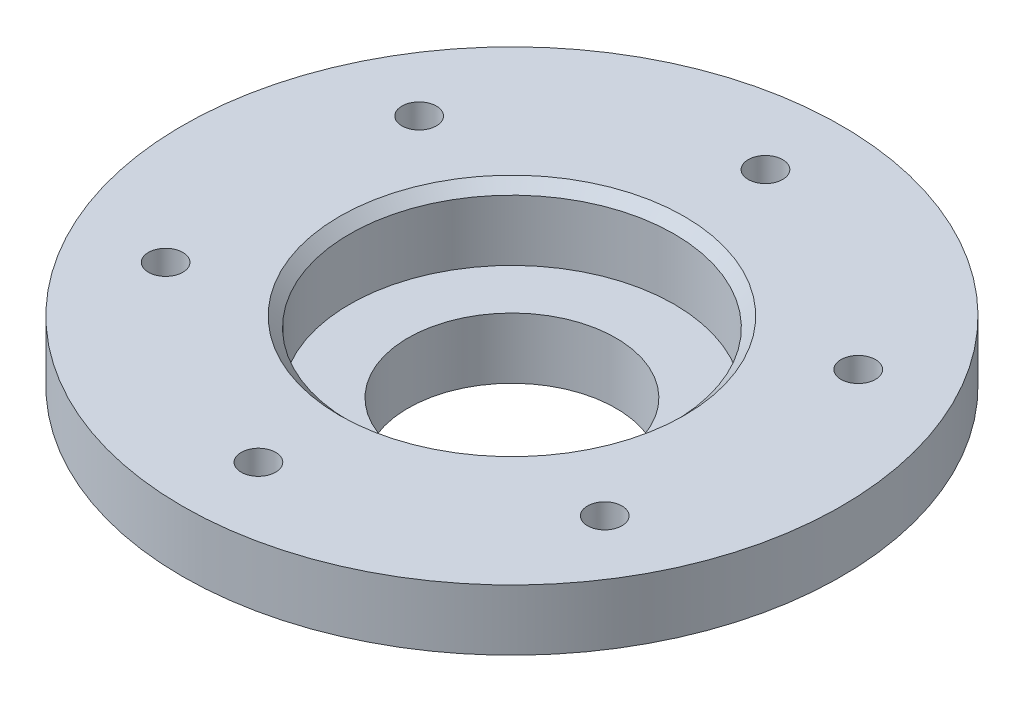
ISO-10303-21;
HEADER;
FILE_DESCRIPTION(('STEP AP214'),'2;1');
FILE_NAME('part.step','',(''),(''),'','','');
FILE_SCHEMA(('AUTOMOTIVE_DESIGN { 1 0 10303 214 1 1 1 1 }'));
ENDSEC;
DATA;
#1=APPLICATION_CONTEXT('core data for automotive mechanical design processes');
#2=APPLICATION_PROTOCOL_DEFINITION('international standard','automotive_design',2000,#1);
#3=PRODUCT_CONTEXT('',#1,'mechanical');
#4=PRODUCT('Part','Part','',(#3));
#5=PRODUCT_RELATED_PRODUCT_CATEGORY('part','',(#4));
#6=PRODUCT_DEFINITION_FORMATION('','',#4);
#7=PRODUCT_DEFINITION_CONTEXT('part definition',#1,'design');
#8=PRODUCT_DEFINITION('design','',#6,#7);
#9=PRODUCT_DEFINITION_SHAPE('','',#8);
#10=(LENGTH_UNIT() NAMED_UNIT(*) SI_UNIT(.MILLI.,.METRE.));
#11=(NAMED_UNIT(*) PLANE_ANGLE_UNIT() SI_UNIT($,.RADIAN.));
#12=(NAMED_UNIT(*) SI_UNIT($,.STERADIAN.) SOLID_ANGLE_UNIT());
#13=UNCERTAINTY_MEASURE_WITH_UNIT(LENGTH_MEASURE(1.E-05),#10,'distance_accuracy_value','');
#14=(GEOMETRIC_REPRESENTATION_CONTEXT(3) GLOBAL_UNCERTAINTY_ASSIGNED_CONTEXT((#13)) GLOBAL_UNIT_ASSIGNED_CONTEXT((#10,
#11,#12)) REPRESENTATION_CONTEXT('',''));
#15=CARTESIAN_POINT('',(0.,0.,0.));
#16=DIRECTION('',(0.,0.,1.));
#17=DIRECTION('',(1.,0.,0.));
#18=AXIS2_PLACEMENT_3D('',#15,#16,#17);
#19=CARTESIAN_POINT('',(20.,7.,0.));
#20=DIRECTION('',(0.,1.,0.));
#21=DIRECTION('',(0.,0.,1.));
#22=AXIS2_PLACEMENT_3D('',#19,#20,#21);
#23=PLANE('',#22);
#24=CARTESIAN_POINT('',(-21.6506350946108,7.,-12.5000000000003));
#25=DIRECTION('',(0.,-1.,0.));
#26=DIRECTION('',(0.,0.,-1.));
#27=AXIS2_PLACEMENT_3D('',#24,#25,#26);
#28=CIRCLE('',#27,3.15);
#29=CARTESIAN_POINT('',(-21.6506350946108,7.,-15.6500000000003));
#30=VERTEX_POINT('',#29);
#31=EDGE_CURVE('E133',#30,#30,#28,.T.);
#32=ORIENTED_EDGE('',*,*,#31,.F.);
#33=EDGE_LOOP('',(#32));
#34=FACE_BOUND('',#33,.T.);
#35=CARTESIAN_POINT('',(-21.6506350946111,7.,12.4999999999998));
#36=DIRECTION('',(0.,-1.,0.));
#37=DIRECTION('',(0.,0.,-1.));
#38=AXIS2_PLACEMENT_3D('',#35,#36,#37);
#39=CIRCLE('',#38,3.15);
#40=CARTESIAN_POINT('',(-21.6506350946111,7.,9.3499999999998));
#41=VERTEX_POINT('',#40);
#42=EDGE_CURVE('E125',#41,#41,#39,.T.);
#43=ORIENTED_EDGE('',*,*,#42,.F.);
#44=EDGE_LOOP('',(#43));
#45=FACE_BOUND('',#44,.T.);
#46=CARTESIAN_POINT('',(21.6506350946109,7.,12.5000000000001));
#47=DIRECTION('',(0.,-1.,0.));
#48=DIRECTION('',(0.,0.,-1.));
#49=AXIS2_PLACEMENT_3D('',#46,#47,#48);
#50=CIRCLE('',#49,3.15);
#51=CARTESIAN_POINT('',(21.6506350946109,7.,9.35000000000011));
#52=VERTEX_POINT('',#51);
#53=EDGE_CURVE('E102',#52,#52,#50,.T.);
#54=ORIENTED_EDGE('',*,*,#53,.F.);
#55=EDGE_LOOP('',(#54));
#56=FACE_BOUND('',#55,.T.);
#57=CARTESIAN_POINT('',(21.650635094611,7.,-12.4999999999999));
#58=DIRECTION('',(0.,-1.,0.));
#59=DIRECTION('',(0.,0.,-1.));
#60=AXIS2_PLACEMENT_3D('',#57,#58,#59);
#61=CIRCLE('',#60,3.15);
#62=CARTESIAN_POINT('',(21.650635094611,7.,-15.6499999999999));
#63=VERTEX_POINT('',#62);
#64=EDGE_CURVE('E92',#63,#63,#61,.T.);
#65=ORIENTED_EDGE('',*,*,#64,.F.);
#66=EDGE_LOOP('',(#65));
#67=FACE_BOUND('',#66,.T.);
#68=CARTESIAN_POINT('',(0.,7.,-25.));
#69=DIRECTION('',(0.,-1.,0.));
#70=DIRECTION('',(0.,0.,-1.));
#71=AXIS2_PLACEMENT_3D('',#68,#69,#70);
#72=CIRCLE('',#71,3.15);
#73=CARTESIAN_POINT('',(0.,7.,-28.15));
#74=VERTEX_POINT('',#73);
#75=EDGE_CURVE('E88',#74,#74,#72,.T.);
#76=ORIENTED_EDGE('',*,*,#75,.F.);
#77=EDGE_LOOP('',(#76));
#78=FACE_BOUND('',#77,.T.);
#79=CARTESIAN_POINT('',(0.,7.,0.));
#80=DIRECTION('',(0.,1.,0.));
#81=DIRECTION('',(0.,0.,1.));
#82=AXIS2_PLACEMENT_3D('',#79,#80,#81);
#83=CIRCLE('',#82,32.5);
#84=CARTESIAN_POINT('',(0.,7.,32.5));
#85=VERTEX_POINT('',#84);
#86=EDGE_CURVE('E68',#85,#85,#83,.T.);
#87=ORIENTED_EDGE('',*,*,#86,.F.);
#88=EDGE_LOOP('',(#87));
#89=FACE_BOUND('',#88,.T.);
#90=CARTESIAN_POINT('',(0.,7.,0.));
#91=DIRECTION('',(0.,1.,0.));
#92=DIRECTION('',(0.,0.,1.));
#93=AXIS2_PLACEMENT_3D('',#90,#91,#92);
#94=CIRCLE('',#93,20.);
#95=CARTESIAN_POINT('',(0.,7.,20.));
#96=VERTEX_POINT('',#95);
#97=EDGE_CURVE('E62',#96,#96,#94,.T.);
#98=ORIENTED_EDGE('',*,*,#97,.T.);
#99=EDGE_LOOP('',(#98));
#100=FACE_BOUND('',#99,.T.);
#101=CARTESIAN_POINT('',(0.,7.,25.));
#102=DIRECTION('',(0.,-1.,0.));
#103=DIRECTION('',(0.,0.,-1.));
#104=AXIS2_PLACEMENT_3D('',#101,#102,#103);
#105=CIRCLE('',#104,3.15);
#106=CARTESIAN_POINT('',(0.,7.,21.85));
#107=VERTEX_POINT('',#106);
#108=EDGE_CURVE('E114',#107,#107,#105,.T.);
#109=ORIENTED_EDGE('',*,*,#108,.F.);
#110=EDGE_LOOP('',(#109));
#111=FACE_BOUND('',#110,.T.);
#112=ADVANCED_FACE('F41',(#34,#45,#56,#67,#78,#89,#100,#111),#23,.F.);
#113=CARTESIAN_POINT('',(0.,0.,0.));
#114=DIRECTION('',(0.,1.,0.));
#115=DIRECTION('',(0.,0.,1.));
#116=AXIS2_PLACEMENT_3D('',#113,#114,#115);
#117=CYLINDRICAL_SURFACE('',#116,10.25);
#118=CARTESIAN_POINT('',(0.,0.,0.));
#119=DIRECTION('',(0.,1.,0.));
#120=DIRECTION('',(0.,0.,1.));
#121=AXIS2_PLACEMENT_3D('',#118,#119,#120);
#122=CIRCLE('',#121,10.25);
#123=CARTESIAN_POINT('',(0.,0.,10.25));
#124=VERTEX_POINT('',#123);
#125=EDGE_CURVE('E65',#124,#124,#122,.T.);
#126=ORIENTED_EDGE('',*,*,#125,.F.);
#127=EDGE_LOOP('',(#126));
#128=FACE_BOUND('',#127,.T.);
#129=CARTESIAN_POINT('',(0.,6.,0.));
#130=DIRECTION('',(0.,1.,0.));
#131=DIRECTION('',(0.,0.,1.));
#132=AXIS2_PLACEMENT_3D('',#129,#130,#131);
#133=CIRCLE('',#132,10.25);
#134=CARTESIAN_POINT('',(0.,6.,10.25));
#135=VERTEX_POINT('',#134);
#136=EDGE_CURVE('E80',#135,#135,#133,.T.);
#137=ORIENTED_EDGE('',*,*,#136,.T.);
#138=EDGE_LOOP('',(#137));
#139=FACE_BOUND('',#138,.T.);
#140=ADVANCED_FACE('F137',(#128,#139),#117,.F.);
#141=CARTESIAN_POINT('',(10.25,0.,0.));
#142=DIRECTION('',(0.,1.,0.));
#143=DIRECTION('',(0.,0.,1.));
#144=AXIS2_PLACEMENT_3D('',#141,#142,#143);
#145=PLANE('',#144);
#146=CARTESIAN_POINT('',(0.,0.,0.));
#147=DIRECTION('',(0.,1.,0.));
#148=DIRECTION('',(0.,0.,1.));
#149=AXIS2_PLACEMENT_3D('',#146,#147,#148);
#150=CIRCLE('',#149,19.0000000000002);
#151=CARTESIAN_POINT('',(0.,0.,19.0000000000002));
#152=VERTEX_POINT('',#151);
#153=EDGE_CURVE('E10',#152,#152,#150,.F.);
#154=ORIENTED_EDGE('',*,*,#153,.T.);
#155=EDGE_LOOP('',(#154));
#156=FACE_BOUND('',#155,.T.);
#157=ORIENTED_EDGE('',*,*,#125,.T.);
#158=EDGE_LOOP('',(#157));
#159=FACE_BOUND('',#158,.T.);
#160=ADVANCED_FACE('F220',(#156,#159),#145,.F.);
#161=CARTESIAN_POINT('',(0.,0.,0.));
#162=DIRECTION('',(0.,1.,0.));
#163=DIRECTION('',(0.,0.,1.));
#164=AXIS2_PLACEMENT_3D('',#161,#162,#163);
#165=CYLINDRICAL_SURFACE('',#164,20.0000000000001);
#166=CARTESIAN_POINT('',(0.,0.999999999999911,0.));
#167=DIRECTION('',(0.,1.,0.));
#168=DIRECTION('',(0.,0.,1.));
#169=AXIS2_PLACEMENT_3D('',#166,#167,#168);
#170=CIRCLE('',#169,20.0000000000001);
#171=CARTESIAN_POINT('',(0.,0.999999999999911,20.0000000000001));
#172=VERTEX_POINT('',#171);
#173=EDGE_CURVE('E47',#172,#172,#170,.T.);
#174=ORIENTED_EDGE('',*,*,#173,.T.);
#175=EDGE_LOOP('',(#174));
#176=FACE_BOUND('',#175,.T.);
#177=ORIENTED_EDGE('',*,*,#97,.F.);
#178=EDGE_LOOP('',(#177));
#179=FACE_BOUND('',#178,.T.);
#180=ADVANCED_FACE('F215',(#176,#179),#165,.T.);
#181=CARTESIAN_POINT('',(0.,0.,0.));
#182=DIRECTION('',(0.,1.,0.));
#183=DIRECTION('',(0.,0.,1.));
#184=AXIS2_PLACEMENT_3D('',#181,#182,#183);
#185=CYLINDRICAL_SURFACE('',#184,32.5);
#186=CARTESIAN_POINT('',(0.,13.,0.));
#187=DIRECTION('',(0.,1.,0.));
#188=DIRECTION('',(0.,0.,1.));
#189=AXIS2_PLACEMENT_3D('',#186,#187,#188);
#190=CIRCLE('',#189,32.5);
#191=CARTESIAN_POINT('',(0.,13.,32.5));
#192=VERTEX_POINT('',#191);
#193=EDGE_CURVE('E72',#192,#192,#190,.T.);
#194=ORIENTED_EDGE('',*,*,#193,.F.);
#195=EDGE_LOOP('',(#194));
#196=FACE_BOUND('',#195,.T.);
#197=ORIENTED_EDGE('',*,*,#86,.T.);
#198=EDGE_LOOP('',(#197));
#199=FACE_BOUND('',#198,.T.);
#200=ADVANCED_FACE('F207',(#196,#199),#185,.T.);
#201=CARTESIAN_POINT('',(32.5,13.,0.));
#202=DIRECTION('',(0.,-1.,0.));
#203=DIRECTION('',(0.,0.,-1.));
#204=AXIS2_PLACEMENT_3D('',#201,#202,#203);
#205=PLANE('',#204);
#206=CARTESIAN_POINT('',(-21.6506350946108,13.,-12.5000000000003));
#207=DIRECTION('',(0.,-1.,0.));
#208=DIRECTION('',(0.,0.,-1.));
#209=AXIS2_PLACEMENT_3D('',#206,#207,#208);
#210=CIRCLE('',#209,1.7);
#211=CARTESIAN_POINT('',(-21.6506350946108,13.,-14.2000000000003));
#212=VERTEX_POINT('',#211);
#213=EDGE_CURVE('E124',#212,#212,#210,.T.);
#214=ORIENTED_EDGE('',*,*,#213,.T.);
#215=EDGE_LOOP('',(#214));
#216=FACE_BOUND('',#215,.T.);
#217=CARTESIAN_POINT('',(-21.6506350946111,13.,12.4999999999998));
#218=DIRECTION('',(0.,-1.,0.));
#219=DIRECTION('',(0.,0.,-1.));
#220=AXIS2_PLACEMENT_3D('',#217,#218,#219);
#221=CIRCLE('',#220,1.7);
#222=CARTESIAN_POINT('',(-21.6506350946111,13.,10.7999999999998));
#223=VERTEX_POINT('',#222);
#224=EDGE_CURVE('E118',#223,#223,#221,.T.);
#225=ORIENTED_EDGE('',*,*,#224,.T.);
#226=EDGE_LOOP('',(#225));
#227=FACE_BOUND('',#226,.T.);
#228=CARTESIAN_POINT('',(0.,13.,25.));
#229=DIRECTION('',(0.,-1.,0.));
#230=DIRECTION('',(0.,0.,-1.));
#231=AXIS2_PLACEMENT_3D('',#228,#229,#230);
#232=CIRCLE('',#231,1.7);
#233=CARTESIAN_POINT('',(0.,13.,23.3));
#234=VERTEX_POINT('',#233);
#235=EDGE_CURVE('E110',#234,#234,#232,.T.);
#236=ORIENTED_EDGE('',*,*,#235,.T.);
#237=EDGE_LOOP('',(#236));
#238=FACE_BOUND('',#237,.T.);
#239=CARTESIAN_POINT('',(21.6506350946109,13.,12.5000000000001));
#240=DIRECTION('',(0.,-1.,0.));
#241=DIRECTION('',(0.,0.,-1.));
#242=AXIS2_PLACEMENT_3D('',#239,#240,#241);
#243=CIRCLE('',#242,1.7);
#244=CARTESIAN_POINT('',(21.6506350946109,13.,10.8000000000001));
#245=VERTEX_POINT('',#244);
#246=EDGE_CURVE('E98',#245,#245,#243,.T.);
#247=ORIENTED_EDGE('',*,*,#246,.T.);
#248=EDGE_LOOP('',(#247));
#249=FACE_BOUND('',#248,.T.);
#250=CARTESIAN_POINT('',(21.650635094611,13.,-12.4999999999999));
#251=DIRECTION('',(0.,-1.,0.));
#252=DIRECTION('',(0.,0.,-1.));
#253=AXIS2_PLACEMENT_3D('',#250,#251,#252);
#254=CIRCLE('',#253,1.7);
#255=CARTESIAN_POINT('',(21.650635094611,13.,-14.1999999999999));
#256=VERTEX_POINT('',#255);
#257=EDGE_CURVE('E90',#256,#256,#254,.T.);
#258=ORIENTED_EDGE('',*,*,#257,.T.);
#259=EDGE_LOOP('',(#258));
#260=FACE_BOUND('',#259,.T.);
#261=CARTESIAN_POINT('',(0.,13.,-25.));
#262=DIRECTION('',(0.,-1.,0.));
#263=DIRECTION('',(0.,0.,-1.));
#264=AXIS2_PLACEMENT_3D('',#261,#262,#263);
#265=CIRCLE('',#264,1.7);
#266=CARTESIAN_POINT('',(0.,13.,-26.7));
#267=VERTEX_POINT('',#266);
#268=EDGE_CURVE('E77',#267,#267,#265,.T.);
#269=ORIENTED_EDGE('',*,*,#268,.T.);
#270=EDGE_LOOP('',(#269));
#271=FACE_BOUND('',#270,.T.);
#272=CARTESIAN_POINT('',(0.,13.,0.));
#273=DIRECTION('',(0.,-1.,0.));
#274=DIRECTION('',(0.,0.,-1.));
#275=AXIS2_PLACEMENT_3D('',#272,#273,#274);
#276=CIRCLE('',#275,17.);
#277=CARTESIAN_POINT('',(0.,13.,-17.));
#278=VERTEX_POINT('',#277);
#279=EDGE_CURVE('E52',#278,#278,#276,.T.);
#280=ORIENTED_EDGE('',*,*,#279,.T.);
#281=EDGE_LOOP('',(#280));
#282=FACE_BOUND('',#281,.T.);
#283=ORIENTED_EDGE('',*,*,#193,.T.);
#284=EDGE_LOOP('',(#283));
#285=FACE_BOUND('',#284,.T.);
#286=ADVANCED_FACE('F202',(#216,#227,#238,#249,#260,#271,#282,#285),#205,.F.);
#287=CARTESIAN_POINT('',(0.,0.,0.));
#288=DIRECTION('',(0.,1.,0.));
#289=DIRECTION('',(0.,0.,1.));
#290=AXIS2_PLACEMENT_3D('',#287,#288,#289);
#291=CYLINDRICAL_SURFACE('',#290,16.);
#292=CARTESIAN_POINT('',(0.,12.,0.));
#293=DIRECTION('',(0.,-1.,0.));
#294=DIRECTION('',(0.,0.,-1.));
#295=AXIS2_PLACEMENT_3D('',#292,#293,#294);
#296=CIRCLE('',#295,16.);
#297=CARTESIAN_POINT('',(0.,12.,-16.));
#298=VERTEX_POINT('',#297);
#299=EDGE_CURVE('E60',#298,#298,#296,.F.);
#300=ORIENTED_EDGE('',*,*,#299,.T.);
#301=EDGE_LOOP('',(#300));
#302=FACE_BOUND('',#301,.T.);
#303=CARTESIAN_POINT('',(0.,6.,0.));
#304=DIRECTION('',(0.,1.,0.));
#305=DIRECTION('',(0.,0.,1.));
#306=AXIS2_PLACEMENT_3D('',#303,#304,#305);
#307=CIRCLE('',#306,16.);
#308=CARTESIAN_POINT('',(0.,6.,16.));
#309=VERTEX_POINT('',#308);
#310=EDGE_CURVE('E74',#309,#309,#307,.T.);
#311=ORIENTED_EDGE('',*,*,#310,.F.);
#312=EDGE_LOOP('',(#311));
#313=FACE_BOUND('',#312,.T.);
#314=ADVANCED_FACE('F203',(#302,#313),#291,.F.);
#315=CARTESIAN_POINT('',(16.,6.,0.));
#316=DIRECTION('',(0.,-1.,0.));
#317=DIRECTION('',(0.,0.,-1.));
#318=AXIS2_PLACEMENT_3D('',#315,#316,#317);
#319=PLANE('',#318);
#320=ORIENTED_EDGE('',*,*,#136,.F.);
#321=EDGE_LOOP('',(#320));
#322=FACE_BOUND('',#321,.T.);
#323=ORIENTED_EDGE('',*,*,#310,.T.);
#324=EDGE_LOOP('',(#323));
#325=FACE_BOUND('',#324,.T.);
#326=ADVANCED_FACE('F197',(#322,#325),#319,.F.);
#327=CARTESIAN_POINT('',(0.,12.,0.));
#328=DIRECTION('',(0.,1.,0.));
#329=DIRECTION('',(0.,0.,1.));
#330=AXIS2_PLACEMENT_3D('',#327,#328,#329);
#331=CONICAL_SURFACE('',#330,16.,0.785398163397441);
#332=ORIENTED_EDGE('',*,*,#279,.F.);
#333=EDGE_LOOP('',(#332));
#334=FACE_BOUND('',#333,.T.);
#335=ORIENTED_EDGE('',*,*,#299,.F.);
#336=EDGE_LOOP('',(#335));
#337=FACE_BOUND('',#336,.T.);
#338=ADVANCED_FACE('F199',(#334,#337),#331,.F.);
#339=CARTESIAN_POINT('',(0.,0.999999999999911,0.));
#340=DIRECTION('',(0.,1.,0.));
#341=DIRECTION('',(0.,0.,1.));
#342=AXIS2_PLACEMENT_3D('',#339,#340,#341);
#343=CONICAL_SURFACE('',#342,20.0000000000001,0.785398163397448);
#344=ORIENTED_EDGE('',*,*,#153,.F.);
#345=EDGE_LOOP('',(#344));
#346=FACE_BOUND('',#345,.T.);
#347=ORIENTED_EDGE('',*,*,#173,.F.);
#348=EDGE_LOOP('',(#347));
#349=FACE_BOUND('',#348,.T.);
#350=ADVANCED_FACE('F42',(#346,#349),#343,.T.);
#351=CARTESIAN_POINT('',(0.,7.,-25.));
#352=DIRECTION('',(0.,-1.,0.));
#353=DIRECTION('',(0.,0.,-1.));
#354=AXIS2_PLACEMENT_3D('',#351,#352,#353);
#355=CYLINDRICAL_SURFACE('',#354,1.7);
#356=ORIENTED_EDGE('',*,*,#268,.F.);
#357=EDGE_LOOP('',(#356));
#358=FACE_BOUND('',#357,.T.);
#359=CARTESIAN_POINT('',(0.,8.45,-25.));
#360=DIRECTION('',(0.,-1.,0.));
#361=DIRECTION('',(0.,0.,-1.));
#362=AXIS2_PLACEMENT_3D('',#359,#360,#361);
#363=CIRCLE('',#362,1.7);
#364=CARTESIAN_POINT('',(0.,8.45,-26.7));
#365=VERTEX_POINT('',#364);
#366=EDGE_CURVE('E83',#365,#365,#363,.T.);
#367=ORIENTED_EDGE('',*,*,#366,.T.);
#368=EDGE_LOOP('',(#367));
#369=FACE_BOUND('',#368,.T.);
#370=ADVANCED_FACE('F195',(#358,#369),#355,.F.);
#371=CARTESIAN_POINT('',(0.,7.,-25.));
#372=DIRECTION('',(0.,-1.,0.));
#373=DIRECTION('',(0.,0.,-1.));
#374=AXIS2_PLACEMENT_3D('',#371,#372,#373);
#375=CONICAL_SURFACE('',#374,3.15,0.785398163397449);
#376=ORIENTED_EDGE('',*,*,#366,.F.);
#377=EDGE_LOOP('',(#376));
#378=FACE_BOUND('',#377,.T.);
#379=ORIENTED_EDGE('',*,*,#75,.T.);
#380=EDGE_LOOP('',(#379));
#381=FACE_BOUND('',#380,.T.);
#382=ADVANCED_FACE('F186',(#378,#381),#375,.F.);
#383=CARTESIAN_POINT('',(21.650635094611,7.,-12.4999999999999));
#384=DIRECTION('',(0.,-1.,0.));
#385=DIRECTION('',(0.,0.,-1.));
#386=AXIS2_PLACEMENT_3D('',#383,#384,#385);
#387=CYLINDRICAL_SURFACE('',#386,1.7);
#388=ORIENTED_EDGE('',*,*,#257,.F.);
#389=EDGE_LOOP('',(#388));
#390=FACE_BOUND('',#389,.T.);
#391=CARTESIAN_POINT('',(21.650635094611,8.45,-12.4999999999999));
#392=DIRECTION('',(0.,-1.,0.));
#393=DIRECTION('',(0.,0.,-1.));
#394=AXIS2_PLACEMENT_3D('',#391,#392,#393);
#395=CIRCLE('',#394,1.7);
#396=CARTESIAN_POINT('',(21.650635094611,8.45,-14.1999999999999));
#397=VERTEX_POINT('',#396);
#398=EDGE_CURVE('E95',#397,#397,#395,.T.);
#399=ORIENTED_EDGE('',*,*,#398,.T.);
#400=EDGE_LOOP('',(#399));
#401=FACE_BOUND('',#400,.T.);
#402=ADVANCED_FACE('F184',(#390,#401),#387,.F.);
#403=CARTESIAN_POINT('',(21.650635094611,7.,-12.4999999999999));
#404=DIRECTION('',(0.,-1.,0.));
#405=DIRECTION('',(0.,0.,-1.));
#406=AXIS2_PLACEMENT_3D('',#403,#404,#405);
#407=CONICAL_SURFACE('',#406,3.15,0.785398163397449);
#408=ORIENTED_EDGE('',*,*,#398,.F.);
#409=EDGE_LOOP('',(#408));
#410=FACE_BOUND('',#409,.T.);
#411=ORIENTED_EDGE('',*,*,#64,.T.);
#412=EDGE_LOOP('',(#411));
#413=FACE_BOUND('',#412,.T.);
#414=ADVANCED_FACE('F179',(#410,#413),#407,.F.);
#415=CARTESIAN_POINT('',(21.6506350946109,7.,12.5000000000001));
#416=DIRECTION('',(0.,-1.,0.));
#417=DIRECTION('',(0.,0.,-1.));
#418=AXIS2_PLACEMENT_3D('',#415,#416,#417);
#419=CYLINDRICAL_SURFACE('',#418,1.7);
#420=ORIENTED_EDGE('',*,*,#246,.F.);
#421=EDGE_LOOP('',(#420));
#422=FACE_BOUND('',#421,.T.);
#423=CARTESIAN_POINT('',(21.6506350946109,8.45,12.5000000000001));
#424=DIRECTION('',(0.,-1.,0.));
#425=DIRECTION('',(0.,0.,-1.));
#426=AXIS2_PLACEMENT_3D('',#423,#424,#425);
#427=CIRCLE('',#426,1.7);
#428=CARTESIAN_POINT('',(21.6506350946109,8.45,10.8000000000001));
#429=VERTEX_POINT('',#428);
#430=EDGE_CURVE('E101',#429,#429,#427,.T.);
#431=ORIENTED_EDGE('',*,*,#430,.T.);
#432=EDGE_LOOP('',(#431));
#433=FACE_BOUND('',#432,.T.);
#434=ADVANCED_FACE('F176',(#422,#433),#419,.F.);
#435=CARTESIAN_POINT('',(21.6506350946109,7.,12.5000000000001));
#436=DIRECTION('',(0.,-1.,0.));
#437=DIRECTION('',(0.,0.,-1.));
#438=AXIS2_PLACEMENT_3D('',#435,#436,#437);
#439=CONICAL_SURFACE('',#438,3.15,0.785398163397449);
#440=ORIENTED_EDGE('',*,*,#430,.F.);
#441=EDGE_LOOP('',(#440));
#442=FACE_BOUND('',#441,.T.);
#443=ORIENTED_EDGE('',*,*,#53,.T.);
#444=EDGE_LOOP('',(#443));
#445=FACE_BOUND('',#444,.T.);
#446=ADVANCED_FACE('F169',(#442,#445),#439,.F.);
#447=CARTESIAN_POINT('',(0.,7.,25.));
#448=DIRECTION('',(0.,-1.,0.));
#449=DIRECTION('',(0.,0.,-1.));
#450=AXIS2_PLACEMENT_3D('',#447,#448,#449);
#451=CYLINDRICAL_SURFACE('',#450,1.7);
#452=ORIENTED_EDGE('',*,*,#235,.F.);
#453=EDGE_LOOP('',(#452));
#454=FACE_BOUND('',#453,.T.);
#455=CARTESIAN_POINT('',(0.,8.45,25.));
#456=DIRECTION('',(0.,-1.,0.));
#457=DIRECTION('',(0.,0.,-1.));
#458=AXIS2_PLACEMENT_3D('',#455,#456,#457);
#459=CIRCLE('',#458,1.7);
#460=CARTESIAN_POINT('',(0.,8.45,23.3));
#461=VERTEX_POINT('',#460);
#462=EDGE_CURVE('E109',#461,#461,#459,.T.);
#463=ORIENTED_EDGE('',*,*,#462,.T.);
#464=EDGE_LOOP('',(#463));
#465=FACE_BOUND('',#464,.T.);
#466=ADVANCED_FACE('F158',(#454,#465),#451,.F.);
#467=CARTESIAN_POINT('',(0.,7.,25.));
#468=DIRECTION('',(0.,-1.,0.));
#469=DIRECTION('',(0.,0.,-1.));
#470=AXIS2_PLACEMENT_3D('',#467,#468,#469);
#471=CONICAL_SURFACE('',#470,3.15,0.785398163397449);
#472=ORIENTED_EDGE('',*,*,#462,.F.);
#473=EDGE_LOOP('',(#472));
#474=FACE_BOUND('',#473,.T.);
#475=ORIENTED_EDGE('',*,*,#108,.T.);
#476=EDGE_LOOP('',(#475));
#477=FACE_BOUND('',#476,.T.);
#478=ADVANCED_FACE('F154',(#474,#477),#471,.F.);
#479=CARTESIAN_POINT('',(-21.6506350946111,7.,12.4999999999998));
#480=DIRECTION('',(0.,-1.,0.));
#481=DIRECTION('',(0.,0.,-1.));
#482=AXIS2_PLACEMENT_3D('',#479,#480,#481);
#483=CYLINDRICAL_SURFACE('',#482,1.7);
#484=ORIENTED_EDGE('',*,*,#224,.F.);
#485=EDGE_LOOP('',(#484));
#486=FACE_BOUND('',#485,.T.);
#487=CARTESIAN_POINT('',(-21.6506350946111,8.45,12.4999999999998));
#488=DIRECTION('',(0.,-1.,0.));
#489=DIRECTION('',(0.,0.,-1.));
#490=AXIS2_PLACEMENT_3D('',#487,#488,#489);
#491=CIRCLE('',#490,1.7);
#492=CARTESIAN_POINT('',(-21.6506350946111,8.45,10.7999999999998));
#493=VERTEX_POINT('',#492);
#494=EDGE_CURVE('E119',#493,#493,#491,.T.);
#495=ORIENTED_EDGE('',*,*,#494,.T.);
#496=EDGE_LOOP('',(#495));
#497=FACE_BOUND('',#496,.T.);
#498=ADVANCED_FACE('F160',(#486,#497),#483,.F.);
#499=CARTESIAN_POINT('',(-21.6506350946111,7.,12.4999999999998));
#500=DIRECTION('',(0.,-1.,0.));
#501=DIRECTION('',(0.,0.,-1.));
#502=AXIS2_PLACEMENT_3D('',#499,#500,#501);
#503=CONICAL_SURFACE('',#502,3.15,0.785398163397449);
#504=ORIENTED_EDGE('',*,*,#494,.F.);
#505=EDGE_LOOP('',(#504));
#506=FACE_BOUND('',#505,.T.);
#507=ORIENTED_EDGE('',*,*,#42,.T.);
#508=EDGE_LOOP('',(#507));
#509=FACE_BOUND('',#508,.T.);
#510=ADVANCED_FACE('F164',(#506,#509),#503,.F.);
#511=CARTESIAN_POINT('',(-21.6506350946108,7.,-12.5000000000003));
#512=DIRECTION('',(0.,-1.,0.));
#513=DIRECTION('',(0.,0.,-1.));
#514=AXIS2_PLACEMENT_3D('',#511,#512,#513);
#515=CYLINDRICAL_SURFACE('',#514,1.7);
#516=ORIENTED_EDGE('',*,*,#213,.F.);
#517=EDGE_LOOP('',(#516));
#518=FACE_BOUND('',#517,.T.);
#519=CARTESIAN_POINT('',(-21.6506350946108,8.45,-12.5000000000003));
#520=DIRECTION('',(0.,-1.,0.));
#521=DIRECTION('',(0.,0.,-1.));
#522=AXIS2_PLACEMENT_3D('',#519,#520,#521);
#523=CIRCLE('',#522,1.7);
#524=CARTESIAN_POINT('',(-21.6506350946108,8.45,-14.2000000000003));
#525=VERTEX_POINT('',#524);
#526=EDGE_CURVE('E126',#525,#525,#523,.T.);
#527=ORIENTED_EDGE('',*,*,#526,.T.);
#528=EDGE_LOOP('',(#527));
#529=FACE_BOUND('',#528,.T.);
#530=ADVANCED_FACE('F315',(#518,#529),#515,.F.);
#531=CARTESIAN_POINT('',(-21.6506350946108,7.,-12.5000000000003));
#532=DIRECTION('',(0.,-1.,0.));
#533=DIRECTION('',(0.,0.,-1.));
#534=AXIS2_PLACEMENT_3D('',#531,#532,#533);
#535=CONICAL_SURFACE('',#534,3.15,0.785398163397449);
#536=ORIENTED_EDGE('',*,*,#526,.F.);
#537=EDGE_LOOP('',(#536));
#538=FACE_BOUND('',#537,.T.);
#539=ORIENTED_EDGE('',*,*,#31,.T.);
#540=EDGE_LOOP('',(#539));
#541=FACE_BOUND('',#540,.T.);
#542=ADVANCED_FACE('F132',(#538,#541),#535,.F.);
#543=CLOSED_SHELL('',(#112,#140,#160,#180,#200,#286,#314,#326,#338,#350,#370,#382,#402,#414,
#434,#446,#466,#478,#498,#510,#530,#542));
#544=MANIFOLD_SOLID_BREP('B2',#543);
#545=ADVANCED_BREP_SHAPE_REPRESENTATION('',(#18,#544),#14);
#546=SHAPE_DEFINITION_REPRESENTATION(#9,#545);
ENDSEC;
END-ISO-10303-21;
